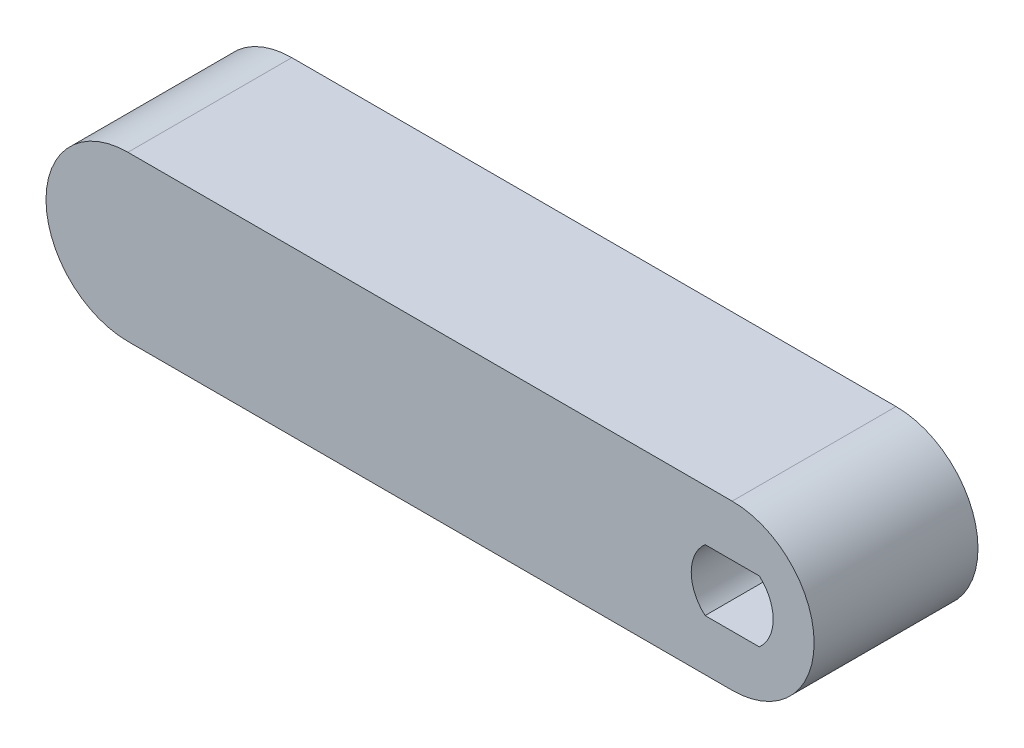
ISO-10303-21;
HEADER;
FILE_DESCRIPTION(('STEP AP214'),'2;1');
FILE_NAME('part.step','',(''),(''),'','','');
FILE_SCHEMA(('AUTOMOTIVE_DESIGN { 1 0 10303 214 1 1 1 1 }'));
ENDSEC;
DATA;
#1=APPLICATION_CONTEXT('core data for automotive mechanical design processes');
#2=APPLICATION_PROTOCOL_DEFINITION('international standard','automotive_design',2000,#1);
#3=PRODUCT_CONTEXT('',#1,'mechanical');
#4=PRODUCT('Part','Part','',(#3));
#5=PRODUCT_RELATED_PRODUCT_CATEGORY('part','',(#4));
#6=PRODUCT_DEFINITION_FORMATION('','',#4);
#7=PRODUCT_DEFINITION_CONTEXT('part definition',#1,'design');
#8=PRODUCT_DEFINITION('design','',#6,#7);
#9=PRODUCT_DEFINITION_SHAPE('','',#8);
#10=(LENGTH_UNIT() NAMED_UNIT(*) SI_UNIT(.MILLI.,.METRE.));
#11=(NAMED_UNIT(*) PLANE_ANGLE_UNIT() SI_UNIT($,.RADIAN.));
#12=(NAMED_UNIT(*) SI_UNIT($,.STERADIAN.) SOLID_ANGLE_UNIT());
#13=UNCERTAINTY_MEASURE_WITH_UNIT(LENGTH_MEASURE(1.E-05),#10,'distance_accuracy_value','');
#14=(GEOMETRIC_REPRESENTATION_CONTEXT(3) GLOBAL_UNCERTAINTY_ASSIGNED_CONTEXT((#13)) GLOBAL_UNIT_ASSIGNED_CONTEXT((#10,
#11,#12)) REPRESENTATION_CONTEXT('',''));
#15=CARTESIAN_POINT('',(0.,0.,0.));
#16=DIRECTION('',(0.,0.,1.));
#17=DIRECTION('',(1.,0.,0.));
#18=AXIS2_PLACEMENT_3D('',#15,#16,#17);
#19=CARTESIAN_POINT('',(0.,0.,-16.));
#20=DIRECTION('',(0.,0.,1.));
#21=DIRECTION('',(1.,0.,0.));
#22=AXIS2_PLACEMENT_3D('',#19,#20,#21);
#23=CYLINDRICAL_SURFACE('',#22,4.);
#24=CARTESIAN_POINT('',(0.,0.,0.));
#25=DIRECTION('',(0.,0.,1.));
#26=DIRECTION('',(1.,0.,0.));
#27=AXIS2_PLACEMENT_3D('',#24,#25,#26);
#28=CIRCLE('',#27,4.);
#29=CARTESIAN_POINT('',(2.64575131106459,-3.,0.));
#30=VERTEX_POINT('',#29);
#31=CARTESIAN_POINT('',(2.64575131106459,3.,0.));
#32=VERTEX_POINT('',#31);
#33=EDGE_CURVE('E141',#30,#32,#28,.T.);
#34=ORIENTED_EDGE('',*,*,#33,.T.);
#35=DIRECTION('',(0.,0.,1.));
#36=VECTOR('',#35,1.);
#37=CARTESIAN_POINT('',(2.64575131106459,3.,-16.));
#38=LINE('',#37,#36);
#39=CARTESIAN_POINT('',(2.64575131106459,3.,-16.));
#40=VERTEX_POINT('',#39);
#41=EDGE_CURVE('E11',#40,#32,#38,.T.);
#42=ORIENTED_EDGE('',*,*,#41,.F.);
#43=CARTESIAN_POINT('',(0.,0.,-16.));
#44=DIRECTION('',(0.,0.,1.));
#45=DIRECTION('',(1.,0.,0.));
#46=AXIS2_PLACEMENT_3D('',#43,#44,#45);
#47=CIRCLE('',#46,4.);
#48=CARTESIAN_POINT('',(2.64575131106459,-3.,-16.));
#49=VERTEX_POINT('',#48);
#50=EDGE_CURVE('E112',#49,#40,#47,.T.);
#51=ORIENTED_EDGE('',*,*,#50,.F.);
#52=DIRECTION('',(0.,0.,1.));
#53=VECTOR('',#52,1.);
#54=CARTESIAN_POINT('',(2.64575131106459,-3.,-16.));
#55=LINE('',#54,#53);
#56=EDGE_CURVE('E120',#49,#30,#55,.T.);
#57=ORIENTED_EDGE('',*,*,#56,.T.);
#58=EDGE_LOOP('',(#34,#42,#51,#57));
#59=FACE_BOUND('',#58,.T.);
#60=ADVANCED_FACE('F33',(#59),#23,.F.);
#61=CARTESIAN_POINT('',(0.,3.,-16.));
#62=DIRECTION('',(0.,1.,0.));
#63=DIRECTION('',(0.,0.,1.));
#64=AXIS2_PLACEMENT_3D('',#61,#62,#63);
#65=PLANE('',#64);
#66=DIRECTION('',(-1.,0.,0.));
#67=VECTOR('',#66,1.);
#68=CARTESIAN_POINT('',(0.,3.,0.));
#69=LINE('',#68,#67);
#70=CARTESIAN_POINT('',(-2.64575131106459,3.,0.));
#71=VERTEX_POINT('',#70);
#72=EDGE_CURVE('E77',#32,#71,#69,.T.);
#73=ORIENTED_EDGE('',*,*,#72,.T.);
#74=DIRECTION('',(0.,0.,1.));
#75=VECTOR('',#74,1.);
#76=CARTESIAN_POINT('',(-2.64575131106459,3.,-16.));
#77=LINE('',#76,#75);
#78=CARTESIAN_POINT('',(-2.64575131106459,3.,-16.));
#79=VERTEX_POINT('',#78);
#80=EDGE_CURVE('E43',#79,#71,#77,.T.);
#81=ORIENTED_EDGE('',*,*,#80,.F.);
#82=DIRECTION('',(-1.,0.,0.));
#83=VECTOR('',#82,1.);
#84=CARTESIAN_POINT('',(0.,3.,-16.));
#85=LINE('',#84,#83);
#86=EDGE_CURVE('E51',#40,#79,#85,.T.);
#87=ORIENTED_EDGE('',*,*,#86,.F.);
#88=ORIENTED_EDGE('',*,*,#41,.T.);
#89=EDGE_LOOP('',(#73,#81,#87,#88));
#90=FACE_BOUND('',#89,.T.);
#91=ADVANCED_FACE('F185',(#90),#65,.F.);
#92=CARTESIAN_POINT('',(-2.64575131106459,-3.,0.));
#93=VERTEX_POINT('',#92);
#94=EDGE_CURVE('E116',#71,#93,#28,.T.);
#95=ORIENTED_EDGE('',*,*,#94,.T.);
#96=DIRECTION('',(0.,0.,1.));
#97=VECTOR('',#96,1.);
#98=CARTESIAN_POINT('',(-2.64575131106459,-3.,-16.));
#99=LINE('',#98,#97);
#100=CARTESIAN_POINT('',(-2.64575131106459,-3.,-16.));
#101=VERTEX_POINT('',#100);
#102=EDGE_CURVE('E114',#101,#93,#99,.T.);
#103=ORIENTED_EDGE('',*,*,#102,.F.);
#104=EDGE_CURVE('E105',#79,#101,#47,.T.);
#105=ORIENTED_EDGE('',*,*,#104,.F.);
#106=ORIENTED_EDGE('',*,*,#80,.T.);
#107=EDGE_LOOP('',(#95,#103,#105,#106));
#108=FACE_BOUND('',#107,.T.);
#109=ADVANCED_FACE('F115',(#108),#23,.F.);
#110=CARTESIAN_POINT('',(-59.,0.,-16.));
#111=DIRECTION('',(0.,0.,1.));
#112=DIRECTION('',(1.,0.,0.));
#113=AXIS2_PLACEMENT_3D('',#110,#111,#112);
#114=CYLINDRICAL_SURFACE('',#113,8.00000000000001);
#115=CARTESIAN_POINT('',(-59.,0.,0.));
#116=DIRECTION('',(0.,0.,1.));
#117=DIRECTION('',(1.,0.,0.));
#118=AXIS2_PLACEMENT_3D('',#115,#116,#117);
#119=CIRCLE('',#118,8.00000000000001);
#120=CARTESIAN_POINT('',(-59.,8.00000000000001,0.));
#121=VERTEX_POINT('',#120);
#122=CARTESIAN_POINT('',(-59.,-8.00000000000001,0.));
#123=VERTEX_POINT('',#122);
#124=EDGE_CURVE('E129',#121,#123,#119,.T.);
#125=ORIENTED_EDGE('',*,*,#124,.F.);
#126=DIRECTION('',(0.,0.,1.));
#127=VECTOR('',#126,1.);
#128=CARTESIAN_POINT('',(-59.,8.00000000000001,-16.));
#129=LINE('',#128,#127);
#130=CARTESIAN_POINT('',(-59.,8.00000000000001,-16.));
#131=VERTEX_POINT('',#130);
#132=EDGE_CURVE('E150',#131,#121,#129,.T.);
#133=ORIENTED_EDGE('',*,*,#132,.F.);
#134=CARTESIAN_POINT('',(-59.,0.,-16.));
#135=DIRECTION('',(0.,0.,1.));
#136=DIRECTION('',(1.,0.,0.));
#137=AXIS2_PLACEMENT_3D('',#134,#135,#136);
#138=CIRCLE('',#137,8.00000000000001);
#139=CARTESIAN_POINT('',(-59.,-8.00000000000001,-16.));
#140=VERTEX_POINT('',#139);
#141=EDGE_CURVE('E146',#131,#140,#138,.T.);
#142=ORIENTED_EDGE('',*,*,#141,.T.);
#143=DIRECTION('',(0.,0.,1.));
#144=VECTOR('',#143,1.);
#145=CARTESIAN_POINT('',(-59.,-8.00000000000001,-16.));
#146=LINE('',#145,#144);
#147=EDGE_CURVE('E37',#140,#123,#146,.T.);
#148=ORIENTED_EDGE('',*,*,#147,.T.);
#149=EDGE_LOOP('',(#125,#133,#142,#148));
#150=FACE_BOUND('',#149,.T.);
#151=ADVANCED_FACE('F35',(#150),#114,.T.);
#152=CARTESIAN_POINT('',(0.,8.,-16.));
#153=DIRECTION('',(0.,1.,0.));
#154=DIRECTION('',(0.,0.,1.));
#155=AXIS2_PLACEMENT_3D('',#152,#153,#154);
#156=PLANE('',#155);
#157=DIRECTION('',(-1.,0.,0.));
#158=VECTOR('',#157,1.);
#159=CARTESIAN_POINT('',(0.,8.,0.));
#160=LINE('',#159,#158);
#161=CARTESIAN_POINT('',(0.,8.,0.));
#162=VERTEX_POINT('',#161);
#163=EDGE_CURVE('E138',#162,#121,#160,.T.);
#164=ORIENTED_EDGE('',*,*,#163,.F.);
#165=DIRECTION('',(0.,0.,1.));
#166=VECTOR('',#165,1.);
#167=CARTESIAN_POINT('',(0.,8.,-16.));
#168=LINE('',#167,#166);
#169=CARTESIAN_POINT('',(0.,8.,-16.));
#170=VERTEX_POINT('',#169);
#171=EDGE_CURVE('E152',#170,#162,#168,.T.);
#172=ORIENTED_EDGE('',*,*,#171,.F.);
#173=DIRECTION('',(-1.,0.,0.));
#174=VECTOR('',#173,1.);
#175=CARTESIAN_POINT('',(0.,8.,-16.));
#176=LINE('',#175,#174);
#177=EDGE_CURVE('E125',#170,#131,#176,.T.);
#178=ORIENTED_EDGE('',*,*,#177,.T.);
#179=ORIENTED_EDGE('',*,*,#132,.T.);
#180=EDGE_LOOP('',(#164,#172,#178,#179));
#181=FACE_BOUND('',#180,.T.);
#182=ADVANCED_FACE('F164',(#181),#156,.T.);
#183=CARTESIAN_POINT('',(0.,0.,-16.));
#184=DIRECTION('',(0.,0.,1.));
#185=DIRECTION('',(1.,0.,0.));
#186=AXIS2_PLACEMENT_3D('',#183,#184,#185);
#187=CYLINDRICAL_SURFACE('',#186,8.);
#188=CARTESIAN_POINT('',(0.,0.,0.));
#189=DIRECTION('',(0.,0.,1.));
#190=DIRECTION('',(1.,0.,0.));
#191=AXIS2_PLACEMENT_3D('',#188,#189,#190);
#192=CIRCLE('',#191,8.);
#193=CARTESIAN_POINT('',(0.,-8.,0.));
#194=VERTEX_POINT('',#193);
#195=EDGE_CURVE('E135',#194,#162,#192,.T.);
#196=ORIENTED_EDGE('',*,*,#195,.F.);
#197=DIRECTION('',(0.,0.,1.));
#198=VECTOR('',#197,1.);
#199=CARTESIAN_POINT('',(0.,-8.,-16.));
#200=LINE('',#199,#198);
#201=CARTESIAN_POINT('',(0.,-8.,-16.));
#202=VERTEX_POINT('',#201);
#203=EDGE_CURVE('E153',#202,#194,#200,.T.);
#204=ORIENTED_EDGE('',*,*,#203,.F.);
#205=CARTESIAN_POINT('',(0.,0.,-16.));
#206=DIRECTION('',(0.,0.,1.));
#207=DIRECTION('',(1.,0.,0.));
#208=AXIS2_PLACEMENT_3D('',#205,#206,#207);
#209=CIRCLE('',#208,8.);
#210=EDGE_CURVE('E172',#202,#170,#209,.T.);
#211=ORIENTED_EDGE('',*,*,#210,.T.);
#212=ORIENTED_EDGE('',*,*,#171,.T.);
#213=EDGE_LOOP('',(#196,#204,#211,#212));
#214=FACE_BOUND('',#213,.T.);
#215=ADVANCED_FACE('F176',(#214),#187,.T.);
#216=CARTESIAN_POINT('',(0.,-8.,-16.));
#217=DIRECTION('',(0.,-1.,0.));
#218=DIRECTION('',(0.,0.,-1.));
#219=AXIS2_PLACEMENT_3D('',#216,#217,#218);
#220=PLANE('',#219);
#221=DIRECTION('',(1.,0.,0.));
#222=VECTOR('',#221,1.);
#223=CARTESIAN_POINT('',(0.,-8.,0.));
#224=LINE('',#223,#222);
#225=EDGE_CURVE('E132',#123,#194,#224,.T.);
#226=ORIENTED_EDGE('',*,*,#225,.F.);
#227=ORIENTED_EDGE('',*,*,#147,.F.);
#228=DIRECTION('',(1.,0.,0.));
#229=VECTOR('',#228,1.);
#230=CARTESIAN_POINT('',(0.,-8.,-16.));
#231=LINE('',#230,#229);
#232=EDGE_CURVE('E170',#140,#202,#231,.T.);
#233=ORIENTED_EDGE('',*,*,#232,.T.);
#234=ORIENTED_EDGE('',*,*,#203,.T.);
#235=EDGE_LOOP('',(#226,#227,#233,#234));
#236=FACE_BOUND('',#235,.T.);
#237=ADVANCED_FACE('F159',(#236),#220,.T.);
#238=CARTESIAN_POINT('',(0.,-3.,-16.));
#239=DIRECTION('',(0.,1.,0.));
#240=DIRECTION('',(0.,0.,1.));
#241=AXIS2_PLACEMENT_3D('',#238,#239,#240);
#242=PLANE('',#241);
#243=DIRECTION('',(-1.,0.,0.));
#244=VECTOR('',#243,1.);
#245=CARTESIAN_POINT('',(0.,-3.,0.));
#246=LINE('',#245,#244);
#247=EDGE_CURVE('E144',#30,#93,#246,.T.);
#248=ORIENTED_EDGE('',*,*,#247,.F.);
#249=ORIENTED_EDGE('',*,*,#56,.F.);
#250=DIRECTION('',(-1.,0.,0.));
#251=VECTOR('',#250,1.);
#252=CARTESIAN_POINT('',(0.,-3.,-16.));
#253=LINE('',#252,#251);
#254=EDGE_CURVE('E109',#49,#101,#253,.T.);
#255=ORIENTED_EDGE('',*,*,#254,.T.);
#256=ORIENTED_EDGE('',*,*,#102,.T.);
#257=EDGE_LOOP('',(#248,#249,#255,#256));
#258=FACE_BOUND('',#257,.T.);
#259=ADVANCED_FACE('F122',(#258),#242,.T.);
#260=CARTESIAN_POINT('',(0.,0.,-16.));
#261=DIRECTION('',(0.,0.,1.));
#262=DIRECTION('',(1.,0.,0.));
#263=AXIS2_PLACEMENT_3D('',#260,#261,#262);
#264=PLANE('',#263);
#265=ORIENTED_EDGE('',*,*,#141,.F.);
#266=ORIENTED_EDGE('',*,*,#177,.F.);
#267=ORIENTED_EDGE('',*,*,#210,.F.);
#268=ORIENTED_EDGE('',*,*,#232,.F.);
#269=EDGE_LOOP('',(#265,#266,#267,#268));
#270=FACE_BOUND('',#269,.T.);
#271=ORIENTED_EDGE('',*,*,#50,.T.);
#272=ORIENTED_EDGE('',*,*,#86,.T.);
#273=ORIENTED_EDGE('',*,*,#104,.T.);
#274=ORIENTED_EDGE('',*,*,#254,.F.);
#275=EDGE_LOOP('',(#271,#272,#273,#274));
#276=FACE_BOUND('',#275,.T.);
#277=ADVANCED_FACE('F107',(#270,#276),#264,.F.);
#278=CARTESIAN_POINT('',(0.,0.,0.));
#279=DIRECTION('',(0.,0.,1.));
#280=DIRECTION('',(1.,0.,0.));
#281=AXIS2_PLACEMENT_3D('',#278,#279,#280);
#282=PLANE('',#281);
#283=ORIENTED_EDGE('',*,*,#124,.T.);
#284=ORIENTED_EDGE('',*,*,#225,.T.);
#285=ORIENTED_EDGE('',*,*,#195,.T.);
#286=ORIENTED_EDGE('',*,*,#163,.T.);
#287=EDGE_LOOP('',(#283,#284,#285,#286));
#288=FACE_BOUND('',#287,.T.);
#289=ORIENTED_EDGE('',*,*,#33,.F.);
#290=ORIENTED_EDGE('',*,*,#247,.T.);
#291=ORIENTED_EDGE('',*,*,#94,.F.);
#292=ORIENTED_EDGE('',*,*,#72,.F.);
#293=EDGE_LOOP('',(#289,#290,#291,#292));
#294=FACE_BOUND('',#293,.T.);
#295=ADVANCED_FACE('F161',(#288,#294),#282,.T.);
#296=CLOSED_SHELL('',(#60,#91,#109,#151,#182,#215,#237,#259,#277,#295));
#297=MANIFOLD_SOLID_BREP('B2',#296);
#298=ADVANCED_BREP_SHAPE_REPRESENTATION('',(#18,#297),#14);
#299=SHAPE_DEFINITION_REPRESENTATION(#9,#298);
ENDSEC;
END-ISO-10303-21;
